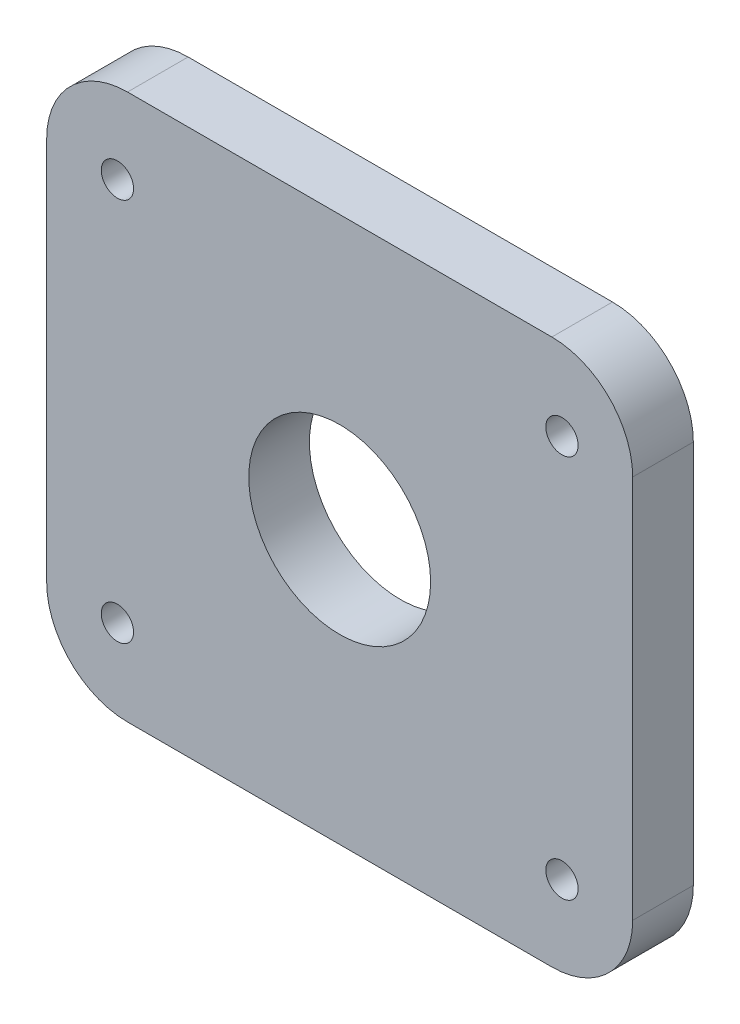
ISO-10303-21;
HEADER;
FILE_DESCRIPTION(('STEP AP214'),'2;1');
FILE_NAME('part.step','',(''),(''),'','','');
FILE_SCHEMA(('AUTOMOTIVE_DESIGN { 1 0 10303 214 1 1 1 1 }'));
ENDSEC;
DATA;
#1=APPLICATION_CONTEXT('core data for automotive mechanical design processes');
#2=APPLICATION_PROTOCOL_DEFINITION('international standard','automotive_design',2000,#1);
#3=PRODUCT_CONTEXT('',#1,'mechanical');
#4=PRODUCT('Part','Part','',(#3));
#5=PRODUCT_RELATED_PRODUCT_CATEGORY('part','',(#4));
#6=PRODUCT_DEFINITION_FORMATION('','',#4);
#7=PRODUCT_DEFINITION_CONTEXT('part definition',#1,'design');
#8=PRODUCT_DEFINITION('design','',#6,#7);
#9=PRODUCT_DEFINITION_SHAPE('','',#8);
#10=(LENGTH_UNIT() NAMED_UNIT(*) SI_UNIT(.MILLI.,.METRE.));
#11=(NAMED_UNIT(*) PLANE_ANGLE_UNIT() SI_UNIT($,.RADIAN.));
#12=(NAMED_UNIT(*) SI_UNIT($,.STERADIAN.) SOLID_ANGLE_UNIT());
#13=UNCERTAINTY_MEASURE_WITH_UNIT(LENGTH_MEASURE(1.E-05),#10,'distance_accuracy_value','');
#14=(GEOMETRIC_REPRESENTATION_CONTEXT(3) GLOBAL_UNCERTAINTY_ASSIGNED_CONTEXT((#13)) GLOBAL_UNIT_ASSIGNED_CONTEXT((#10,
#11,#12)) REPRESENTATION_CONTEXT('',''));
#15=CARTESIAN_POINT('',(0.,0.,0.));
#16=DIRECTION('',(0.,0.,1.));
#17=DIRECTION('',(1.,0.,0.));
#18=AXIS2_PLACEMENT_3D('',#15,#16,#17);
#19=CARTESIAN_POINT('',(4.,4.,3.));
#20=DIRECTION('',(0.,0.,-1.));
#21=DIRECTION('',(-1.,0.,0.));
#22=AXIS2_PLACEMENT_3D('',#19,#20,#21);
#23=CYLINDRICAL_SURFACE('',#22,4.);
#24=CARTESIAN_POINT('',(4.,4.,0.));
#25=DIRECTION('',(0.,0.,1.));
#26=DIRECTION('',(-1.,0.,0.));
#27=AXIS2_PLACEMENT_3D('',#24,#25,#26);
#28=CIRCLE('',#27,4.);
#29=CARTESIAN_POINT('',(0.,4.,0.));
#30=VERTEX_POINT('',#29);
#31=CARTESIAN_POINT('',(4.,0.,0.));
#32=VERTEX_POINT('',#31);
#33=EDGE_CURVE('E131',#30,#32,#28,.T.);
#34=ORIENTED_EDGE('',*,*,#33,.T.);
#35=DIRECTION('',(0.,0.,-1.));
#36=VECTOR('',#35,1.);
#37=CARTESIAN_POINT('',(4.,0.,3.));
#38=LINE('',#37,#36);
#39=CARTESIAN_POINT('',(4.,0.,3.));
#40=VERTEX_POINT('',#39);
#41=EDGE_CURVE('E11',#40,#32,#38,.T.);
#42=ORIENTED_EDGE('',*,*,#41,.F.);
#43=CARTESIAN_POINT('',(4.,4.,3.));
#44=DIRECTION('',(0.,0.,1.));
#45=DIRECTION('',(-1.,0.,0.));
#46=AXIS2_PLACEMENT_3D('',#43,#44,#45);
#47=CIRCLE('',#46,4.);
#48=CARTESIAN_POINT('',(0.,4.,3.));
#49=VERTEX_POINT('',#48);
#50=EDGE_CURVE('E146',#49,#40,#47,.T.);
#51=ORIENTED_EDGE('',*,*,#50,.F.);
#52=DIRECTION('',(0.,0.,-1.));
#53=VECTOR('',#52,1.);
#54=CARTESIAN_POINT('',(0.,4.,3.));
#55=LINE('',#54,#53);
#56=EDGE_CURVE('E127',#49,#30,#55,.T.);
#57=ORIENTED_EDGE('',*,*,#56,.T.);
#58=EDGE_LOOP('',(#34,#42,#51,#57));
#59=FACE_BOUND('',#58,.T.);
#60=ADVANCED_FACE('F35',(#59),#23,.T.);
#61=CARTESIAN_POINT('',(4.,0.,3.));
#62=DIRECTION('',(0.,1.,0.));
#63=DIRECTION('',(0.,0.,1.));
#64=AXIS2_PLACEMENT_3D('',#61,#62,#63);
#65=PLANE('',#64);
#66=DIRECTION('',(1.,0.,0.));
#67=VECTOR('',#66,1.);
#68=CARTESIAN_POINT('',(4.,0.,0.));
#69=LINE('',#68,#67);
#70=CARTESIAN_POINT('',(25.,0.,0.));
#71=VERTEX_POINT('',#70);
#72=EDGE_CURVE('E134',#32,#71,#69,.T.);
#73=ORIENTED_EDGE('',*,*,#72,.T.);
#74=DIRECTION('',(0.,0.,-1.));
#75=VECTOR('',#74,1.);
#76=CARTESIAN_POINT('',(25.,0.,3.));
#77=LINE('',#76,#75);
#78=CARTESIAN_POINT('',(25.,0.,3.));
#79=VERTEX_POINT('',#78);
#80=EDGE_CURVE('E43',#79,#71,#77,.T.);
#81=ORIENTED_EDGE('',*,*,#80,.F.);
#82=DIRECTION('',(1.,0.,0.));
#83=VECTOR('',#82,1.);
#84=CARTESIAN_POINT('',(4.,0.,3.));
#85=LINE('',#84,#83);
#86=EDGE_CURVE('E94',#40,#79,#85,.T.);
#87=ORIENTED_EDGE('',*,*,#86,.F.);
#88=ORIENTED_EDGE('',*,*,#41,.T.);
#89=EDGE_LOOP('',(#73,#81,#87,#88));
#90=FACE_BOUND('',#89,.T.);
#91=ADVANCED_FACE('F242',(#90),#65,.F.);
#92=CARTESIAN_POINT('',(25.,4.,3.));
#93=DIRECTION('',(0.,0.,-1.));
#94=DIRECTION('',(-1.,0.,0.));
#95=AXIS2_PLACEMENT_3D('',#92,#93,#94);
#96=CYLINDRICAL_SURFACE('',#95,4.);
#97=CARTESIAN_POINT('',(25.,4.,0.));
#98=DIRECTION('',(0.,0.,1.));
#99=DIRECTION('',(1.,0.,0.));
#100=AXIS2_PLACEMENT_3D('',#97,#98,#99);
#101=CIRCLE('',#100,4.);
#102=CARTESIAN_POINT('',(29.,4.,0.));
#103=VERTEX_POINT('',#102);
#104=EDGE_CURVE('E137',#71,#103,#101,.T.);
#105=ORIENTED_EDGE('',*,*,#104,.T.);
#106=DIRECTION('',(0.,0.,-1.));
#107=VECTOR('',#106,1.);
#108=CARTESIAN_POINT('',(29.,4.,3.));
#109=LINE('',#108,#107);
#110=CARTESIAN_POINT('',(29.,4.,3.));
#111=VERTEX_POINT('',#110);
#112=EDGE_CURVE('E153',#111,#103,#109,.T.);
#113=ORIENTED_EDGE('',*,*,#112,.F.);
#114=CARTESIAN_POINT('',(25.,4.,3.));
#115=DIRECTION('',(0.,0.,1.));
#116=DIRECTION('',(1.,0.,0.));
#117=AXIS2_PLACEMENT_3D('',#114,#115,#116);
#118=CIRCLE('',#117,4.);
#119=EDGE_CURVE('E161',#79,#111,#118,.T.);
#120=ORIENTED_EDGE('',*,*,#119,.F.);
#121=ORIENTED_EDGE('',*,*,#80,.T.);
#122=EDGE_LOOP('',(#105,#113,#120,#121));
#123=FACE_BOUND('',#122,.T.);
#124=ADVANCED_FACE('F159',(#123),#96,.T.);
#125=CARTESIAN_POINT('',(29.,4.,3.));
#126=DIRECTION('',(-1.,0.,0.));
#127=DIRECTION('',(0.,-1.,0.));
#128=AXIS2_PLACEMENT_3D('',#125,#126,#127);
#129=PLANE('',#128);
#130=DIRECTION('',(0.,1.,0.));
#131=VECTOR('',#130,1.);
#132=CARTESIAN_POINT('',(29.,4.,0.));
#133=LINE('',#132,#131);
#134=CARTESIAN_POINT('',(29.,23.,0.));
#135=VERTEX_POINT('',#134);
#136=EDGE_CURVE('E139',#103,#135,#133,.T.);
#137=ORIENTED_EDGE('',*,*,#136,.T.);
#138=DIRECTION('',(0.,0.,-1.));
#139=VECTOR('',#138,1.);
#140=CARTESIAN_POINT('',(29.,23.,3.));
#141=LINE('',#140,#139);
#142=CARTESIAN_POINT('',(29.,23.,3.));
#143=VERTEX_POINT('',#142);
#144=EDGE_CURVE('E150',#143,#135,#141,.T.);
#145=ORIENTED_EDGE('',*,*,#144,.F.);
#146=DIRECTION('',(0.,1.,0.));
#147=VECTOR('',#146,1.);
#148=CARTESIAN_POINT('',(29.,4.,3.));
#149=LINE('',#148,#147);
#150=EDGE_CURVE('E173',#111,#143,#149,.T.);
#151=ORIENTED_EDGE('',*,*,#150,.F.);
#152=ORIENTED_EDGE('',*,*,#112,.T.);
#153=EDGE_LOOP('',(#137,#145,#151,#152));
#154=FACE_BOUND('',#153,.T.);
#155=ADVANCED_FACE('F169',(#154),#129,.F.);
#156=CARTESIAN_POINT('',(25.,23.,3.));
#157=DIRECTION('',(0.,0.,-1.));
#158=DIRECTION('',(-1.,0.,0.));
#159=AXIS2_PLACEMENT_3D('',#156,#157,#158);
#160=CYLINDRICAL_SURFACE('',#159,4.);
#161=CARTESIAN_POINT('',(25.,23.,0.));
#162=DIRECTION('',(0.,0.,1.));
#163=DIRECTION('',(-1.,0.,0.));
#164=AXIS2_PLACEMENT_3D('',#161,#162,#163);
#165=CIRCLE('',#164,4.);
#166=CARTESIAN_POINT('',(25.,27.,0.));
#167=VERTEX_POINT('',#166);
#168=EDGE_CURVE('E141',#135,#167,#165,.T.);
#169=ORIENTED_EDGE('',*,*,#168,.T.);
#170=DIRECTION('',(0.,0.,-1.));
#171=VECTOR('',#170,1.);
#172=CARTESIAN_POINT('',(25.,27.,3.));
#173=LINE('',#172,#171);
#174=CARTESIAN_POINT('',(25.,27.,3.));
#175=VERTEX_POINT('',#174);
#176=EDGE_CURVE('E122',#175,#167,#173,.T.);
#177=ORIENTED_EDGE('',*,*,#176,.F.);
#178=CARTESIAN_POINT('',(25.,23.,3.));
#179=DIRECTION('',(0.,0.,1.));
#180=DIRECTION('',(-1.,0.,0.));
#181=AXIS2_PLACEMENT_3D('',#178,#179,#180);
#182=CIRCLE('',#181,4.);
#183=EDGE_CURVE('E113',#143,#175,#182,.T.);
#184=ORIENTED_EDGE('',*,*,#183,.F.);
#185=ORIENTED_EDGE('',*,*,#144,.T.);
#186=EDGE_LOOP('',(#169,#177,#184,#185));
#187=FACE_BOUND('',#186,.T.);
#188=ADVANCED_FACE('F172',(#187),#160,.T.);
#189=CARTESIAN_POINT('',(4.,27.,3.));
#190=DIRECTION('',(0.,-1.,0.));
#191=DIRECTION('',(0.,0.,-1.));
#192=AXIS2_PLACEMENT_3D('',#189,#190,#191);
#193=PLANE('',#192);
#194=DIRECTION('',(-1.,0.,0.));
#195=VECTOR('',#194,1.);
#196=CARTESIAN_POINT('',(4.,27.,0.));
#197=LINE('',#196,#195);
#198=CARTESIAN_POINT('',(4.,27.,0.));
#199=VERTEX_POINT('',#198);
#200=EDGE_CURVE('E121',#167,#199,#197,.T.);
#201=ORIENTED_EDGE('',*,*,#200,.T.);
#202=DIRECTION('',(0.,0.,-1.));
#203=VECTOR('',#202,1.);
#204=CARTESIAN_POINT('',(4.,27.,3.));
#205=LINE('',#204,#203);
#206=CARTESIAN_POINT('',(4.,27.,3.));
#207=VERTEX_POINT('',#206);
#208=EDGE_CURVE('E118',#207,#199,#205,.T.);
#209=ORIENTED_EDGE('',*,*,#208,.F.);
#210=DIRECTION('',(-1.,0.,0.));
#211=VECTOR('',#210,1.);
#212=CARTESIAN_POINT('',(4.,27.,3.));
#213=LINE('',#212,#211);
#214=EDGE_CURVE('E107',#175,#207,#213,.T.);
#215=ORIENTED_EDGE('',*,*,#214,.F.);
#216=ORIENTED_EDGE('',*,*,#176,.T.);
#217=EDGE_LOOP('',(#201,#209,#215,#216));
#218=FACE_BOUND('',#217,.T.);
#219=ADVANCED_FACE('F119',(#218),#193,.F.);
#220=CARTESIAN_POINT('',(4.,23.,3.));
#221=DIRECTION('',(0.,0.,-1.));
#222=DIRECTION('',(-1.,0.,0.));
#223=AXIS2_PLACEMENT_3D('',#220,#221,#222);
#224=CYLINDRICAL_SURFACE('',#223,4.);
#225=CARTESIAN_POINT('',(4.,23.,0.));
#226=DIRECTION('',(0.,0.,1.));
#227=DIRECTION('',(-1.,0.,0.));
#228=AXIS2_PLACEMENT_3D('',#225,#226,#227);
#229=CIRCLE('',#228,4.);
#230=CARTESIAN_POINT('',(0.,23.,0.));
#231=VERTEX_POINT('',#230);
#232=EDGE_CURVE('E80',#199,#231,#229,.T.);
#233=ORIENTED_EDGE('',*,*,#232,.T.);
#234=DIRECTION('',(0.,0.,-1.));
#235=VECTOR('',#234,1.);
#236=CARTESIAN_POINT('',(0.,23.,3.));
#237=LINE('',#236,#235);
#238=CARTESIAN_POINT('',(0.,23.,3.));
#239=VERTEX_POINT('',#238);
#240=EDGE_CURVE('E123',#239,#231,#237,.T.);
#241=ORIENTED_EDGE('',*,*,#240,.F.);
#242=CARTESIAN_POINT('',(4.,23.,3.));
#243=DIRECTION('',(0.,0.,1.));
#244=DIRECTION('',(-1.,0.,0.));
#245=AXIS2_PLACEMENT_3D('',#242,#243,#244);
#246=CIRCLE('',#245,4.);
#247=EDGE_CURVE('E111',#207,#239,#246,.T.);
#248=ORIENTED_EDGE('',*,*,#247,.F.);
#249=ORIENTED_EDGE('',*,*,#208,.T.);
#250=EDGE_LOOP('',(#233,#241,#248,#249));
#251=FACE_BOUND('',#250,.T.);
#252=ADVANCED_FACE('F125',(#251),#224,.T.);
#253=CARTESIAN_POINT('',(0.,4.,3.));
#254=DIRECTION('',(1.,0.,0.));
#255=DIRECTION('',(0.,1.,0.));
#256=AXIS2_PLACEMENT_3D('',#253,#254,#255);
#257=PLANE('',#256);
#258=DIRECTION('',(0.,-1.,0.));
#259=VECTOR('',#258,1.);
#260=CARTESIAN_POINT('',(0.,4.,0.));
#261=LINE('',#260,#259);
#262=EDGE_CURVE('E86',#231,#30,#261,.T.);
#263=ORIENTED_EDGE('',*,*,#262,.T.);
#264=ORIENTED_EDGE('',*,*,#56,.F.);
#265=DIRECTION('',(0.,-1.,0.));
#266=VECTOR('',#265,1.);
#267=CARTESIAN_POINT('',(0.,4.,3.));
#268=LINE('',#267,#266);
#269=EDGE_CURVE('E51',#239,#49,#268,.T.);
#270=ORIENTED_EDGE('',*,*,#269,.F.);
#271=ORIENTED_EDGE('',*,*,#240,.T.);
#272=EDGE_LOOP('',(#263,#264,#270,#271));
#273=FACE_BOUND('',#272,.T.);
#274=ADVANCED_FACE('F221',(#273),#257,.F.);
#275=CARTESIAN_POINT('',(4.,4.,3.));
#276=DIRECTION('',(0.,0.,-1.));
#277=DIRECTION('',(-1.,0.,0.));
#278=AXIS2_PLACEMENT_3D('',#275,#276,#277);
#279=PLANE('',#278);
#280=CARTESIAN_POINT('',(3.49999999999993,23.,3.));
#281=DIRECTION('',(0.,0.,1.));
#282=DIRECTION('',(1.,0.,0.));
#283=AXIS2_PLACEMENT_3D('',#280,#281,#282);
#284=CIRCLE('',#283,0.8);
#285=CARTESIAN_POINT('',(4.29999999999993,23.,3.));
#286=VERTEX_POINT('',#285);
#287=EDGE_CURVE('E191',#286,#286,#284,.T.);
#288=ORIENTED_EDGE('',*,*,#287,.F.);
#289=EDGE_LOOP('',(#288));
#290=FACE_BOUND('',#289,.T.);
#291=CARTESIAN_POINT('',(25.4999999999999,23.,3.));
#292=DIRECTION('',(0.,0.,1.));
#293=DIRECTION('',(1.,0.,0.));
#294=AXIS2_PLACEMENT_3D('',#291,#292,#293);
#295=CIRCLE('',#294,0.799999999999999);
#296=CARTESIAN_POINT('',(26.2999999999999,23.,3.));
#297=VERTEX_POINT('',#296);
#298=EDGE_CURVE('E197',#297,#297,#295,.T.);
#299=ORIENTED_EDGE('',*,*,#298,.F.);
#300=EDGE_LOOP('',(#299));
#301=FACE_BOUND('',#300,.T.);
#302=CARTESIAN_POINT('',(25.5,4.,3.));
#303=DIRECTION('',(0.,0.,1.));
#304=DIRECTION('',(1.,0.,0.));
#305=AXIS2_PLACEMENT_3D('',#302,#303,#304);
#306=CIRCLE('',#305,0.799999999999999);
#307=CARTESIAN_POINT('',(26.3,4.,3.));
#308=VERTEX_POINT('',#307);
#309=EDGE_CURVE('E203',#308,#308,#306,.T.);
#310=ORIENTED_EDGE('',*,*,#309,.F.);
#311=EDGE_LOOP('',(#310));
#312=FACE_BOUND('',#311,.T.);
#313=CARTESIAN_POINT('',(3.5,4.,3.));
#314=DIRECTION('',(0.,0.,1.));
#315=DIRECTION('',(1.,0.,0.));
#316=AXIS2_PLACEMENT_3D('',#313,#314,#315);
#317=CIRCLE('',#316,0.800000000000001);
#318=CARTESIAN_POINT('',(4.3,4.,3.));
#319=VERTEX_POINT('',#318);
#320=EDGE_CURVE('E185',#319,#319,#317,.T.);
#321=ORIENTED_EDGE('',*,*,#320,.F.);
#322=EDGE_LOOP('',(#321));
#323=FACE_BOUND('',#322,.T.);
#324=CARTESIAN_POINT('',(14.5,13.5,3.));
#325=DIRECTION('',(0.,0.,1.));
#326=DIRECTION('',(1.,0.,0.));
#327=AXIS2_PLACEMENT_3D('',#324,#325,#326);
#328=CIRCLE('',#327,4.5);
#329=CARTESIAN_POINT('',(19.,13.5,3.));
#330=VERTEX_POINT('',#329);
#331=EDGE_CURVE('E179',#330,#330,#328,.T.);
#332=ORIENTED_EDGE('',*,*,#331,.F.);
#333=EDGE_LOOP('',(#332));
#334=FACE_BOUND('',#333,.T.);
#335=ORIENTED_EDGE('',*,*,#50,.T.);
#336=ORIENTED_EDGE('',*,*,#86,.T.);
#337=ORIENTED_EDGE('',*,*,#119,.T.);
#338=ORIENTED_EDGE('',*,*,#150,.T.);
#339=ORIENTED_EDGE('',*,*,#183,.T.);
#340=ORIENTED_EDGE('',*,*,#214,.T.);
#341=ORIENTED_EDGE('',*,*,#247,.T.);
#342=ORIENTED_EDGE('',*,*,#269,.T.);
#343=EDGE_LOOP('',(#335,#336,#337,#338,#339,#340,#341,#342));
#344=FACE_BOUND('',#343,.T.);
#345=ADVANCED_FACE('F109',(#290,#301,#312,#323,#334,#344),#279,.F.);
#346=CARTESIAN_POINT('',(4.,4.,0.));
#347=DIRECTION('',(0.,0.,-1.));
#348=DIRECTION('',(-1.,0.,0.));
#349=AXIS2_PLACEMENT_3D('',#346,#347,#348);
#350=PLANE('',#349);
#351=CARTESIAN_POINT('',(3.49999999999993,23.,0.));
#352=DIRECTION('',(0.,0.,1.));
#353=DIRECTION('',(1.,0.,0.));
#354=AXIS2_PLACEMENT_3D('',#351,#352,#353);
#355=CIRCLE('',#354,0.8);
#356=CARTESIAN_POINT('',(4.29999999999993,23.,0.));
#357=VERTEX_POINT('',#356);
#358=EDGE_CURVE('E194',#357,#357,#355,.T.);
#359=ORIENTED_EDGE('',*,*,#358,.T.);
#360=EDGE_LOOP('',(#359));
#361=FACE_BOUND('',#360,.T.);
#362=CARTESIAN_POINT('',(25.4999999999999,23.,0.));
#363=DIRECTION('',(0.,0.,1.));
#364=DIRECTION('',(1.,0.,0.));
#365=AXIS2_PLACEMENT_3D('',#362,#363,#364);
#366=CIRCLE('',#365,0.799999999999999);
#367=CARTESIAN_POINT('',(26.2999999999999,23.,0.));
#368=VERTEX_POINT('',#367);
#369=EDGE_CURVE('E200',#368,#368,#366,.T.);
#370=ORIENTED_EDGE('',*,*,#369,.T.);
#371=EDGE_LOOP('',(#370));
#372=FACE_BOUND('',#371,.T.);
#373=CARTESIAN_POINT('',(25.5,4.,0.));
#374=DIRECTION('',(0.,0.,1.));
#375=DIRECTION('',(1.,0.,0.));
#376=AXIS2_PLACEMENT_3D('',#373,#374,#375);
#377=CIRCLE('',#376,0.799999999999999);
#378=CARTESIAN_POINT('',(26.3,4.,0.));
#379=VERTEX_POINT('',#378);
#380=EDGE_CURVE('E188',#379,#379,#377,.T.);
#381=ORIENTED_EDGE('',*,*,#380,.T.);
#382=EDGE_LOOP('',(#381));
#383=FACE_BOUND('',#382,.T.);
#384=CARTESIAN_POINT('',(3.5,4.,0.));
#385=DIRECTION('',(0.,0.,1.));
#386=DIRECTION('',(1.,0.,0.));
#387=AXIS2_PLACEMENT_3D('',#384,#385,#386);
#388=CIRCLE('',#387,0.800000000000001);
#389=CARTESIAN_POINT('',(4.3,4.,0.));
#390=VERTEX_POINT('',#389);
#391=EDGE_CURVE('E182',#390,#390,#388,.T.);
#392=ORIENTED_EDGE('',*,*,#391,.T.);
#393=EDGE_LOOP('',(#392));
#394=FACE_BOUND('',#393,.T.);
#395=CARTESIAN_POINT('',(14.5,13.5,0.));
#396=DIRECTION('',(0.,0.,1.));
#397=DIRECTION('',(1.,0.,0.));
#398=AXIS2_PLACEMENT_3D('',#395,#396,#397);
#399=CIRCLE('',#398,4.5);
#400=CARTESIAN_POINT('',(19.,13.5,0.));
#401=VERTEX_POINT('',#400);
#402=EDGE_CURVE('E135',#401,#401,#399,.T.);
#403=ORIENTED_EDGE('',*,*,#402,.T.);
#404=EDGE_LOOP('',(#403));
#405=FACE_BOUND('',#404,.T.);
#406=ORIENTED_EDGE('',*,*,#33,.F.);
#407=ORIENTED_EDGE('',*,*,#262,.F.);
#408=ORIENTED_EDGE('',*,*,#232,.F.);
#409=ORIENTED_EDGE('',*,*,#200,.F.);
#410=ORIENTED_EDGE('',*,*,#168,.F.);
#411=ORIENTED_EDGE('',*,*,#136,.F.);
#412=ORIENTED_EDGE('',*,*,#104,.F.);
#413=ORIENTED_EDGE('',*,*,#72,.F.);
#414=EDGE_LOOP('',(#406,#407,#408,#409,#410,#411,#412,#413));
#415=FACE_BOUND('',#414,.T.);
#416=ADVANCED_FACE('F165',(#361,#372,#383,#394,#405,#415),#350,.T.);
#417=CARTESIAN_POINT('',(14.5,13.5,0.));
#418=DIRECTION('',(0.,0.,1.));
#419=DIRECTION('',(1.,0.,0.));
#420=AXIS2_PLACEMENT_3D('',#417,#418,#419);
#421=CYLINDRICAL_SURFACE('',#420,4.5);
#422=ORIENTED_EDGE('',*,*,#402,.F.);
#423=EDGE_LOOP('',(#422));
#424=FACE_BOUND('',#423,.T.);
#425=ORIENTED_EDGE('',*,*,#331,.T.);
#426=EDGE_LOOP('',(#425));
#427=FACE_BOUND('',#426,.T.);
#428=ADVANCED_FACE('F228',(#424,#427),#421,.F.);
#429=CARTESIAN_POINT('',(3.5,4.,0.));
#430=DIRECTION('',(0.,0.,1.));
#431=DIRECTION('',(1.,0.,0.));
#432=AXIS2_PLACEMENT_3D('',#429,#430,#431);
#433=CYLINDRICAL_SURFACE('',#432,0.800000000000001);
#434=ORIENTED_EDGE('',*,*,#391,.F.);
#435=EDGE_LOOP('',(#434));
#436=FACE_BOUND('',#435,.T.);
#437=ORIENTED_EDGE('',*,*,#320,.T.);
#438=EDGE_LOOP('',(#437));
#439=FACE_BOUND('',#438,.T.);
#440=ADVANCED_FACE('F215',(#436,#439),#433,.F.);
#441=CARTESIAN_POINT('',(25.5,4.,0.));
#442=DIRECTION('',(0.,0.,1.));
#443=DIRECTION('',(1.,0.,0.));
#444=AXIS2_PLACEMENT_3D('',#441,#442,#443);
#445=CYLINDRICAL_SURFACE('',#444,0.799999999999999);
#446=ORIENTED_EDGE('',*,*,#380,.F.);
#447=EDGE_LOOP('',(#446));
#448=FACE_BOUND('',#447,.T.);
#449=ORIENTED_EDGE('',*,*,#309,.T.);
#450=EDGE_LOOP('',(#449));
#451=FACE_BOUND('',#450,.T.);
#452=ADVANCED_FACE('F211',(#448,#451),#445,.F.);
#453=CARTESIAN_POINT('',(25.4999999999999,23.,0.));
#454=DIRECTION('',(0.,0.,1.));
#455=DIRECTION('',(1.,0.,0.));
#456=AXIS2_PLACEMENT_3D('',#453,#454,#455);
#457=CYLINDRICAL_SURFACE('',#456,0.799999999999999);
#458=ORIENTED_EDGE('',*,*,#369,.F.);
#459=EDGE_LOOP('',(#458));
#460=FACE_BOUND('',#459,.T.);
#461=ORIENTED_EDGE('',*,*,#298,.T.);
#462=EDGE_LOOP('',(#461));
#463=FACE_BOUND('',#462,.T.);
#464=ADVANCED_FACE('F214',(#460,#463),#457,.F.);
#465=CARTESIAN_POINT('',(3.49999999999993,23.,0.));
#466=DIRECTION('',(0.,0.,1.));
#467=DIRECTION('',(1.,0.,0.));
#468=AXIS2_PLACEMENT_3D('',#465,#466,#467);
#469=CYLINDRICAL_SURFACE('',#468,0.8);
#470=ORIENTED_EDGE('',*,*,#358,.F.);
#471=EDGE_LOOP('',(#470));
#472=FACE_BOUND('',#471,.T.);
#473=ORIENTED_EDGE('',*,*,#287,.T.);
#474=EDGE_LOOP('',(#473));
#475=FACE_BOUND('',#474,.T.);
#476=ADVANCED_FACE('F324',(#472,#475),#469,.F.);
#477=CLOSED_SHELL('',(#60,#91,#124,#155,#188,#219,#252,#274,#345,#416,#428,#440,#452,#464,#476));
#478=MANIFOLD_SOLID_BREP('B2',#477);
#479=ADVANCED_BREP_SHAPE_REPRESENTATION('',(#18,#478),#14);
#480=SHAPE_DEFINITION_REPRESENTATION(#9,#479);
ENDSEC;
END-ISO-10303-21;
